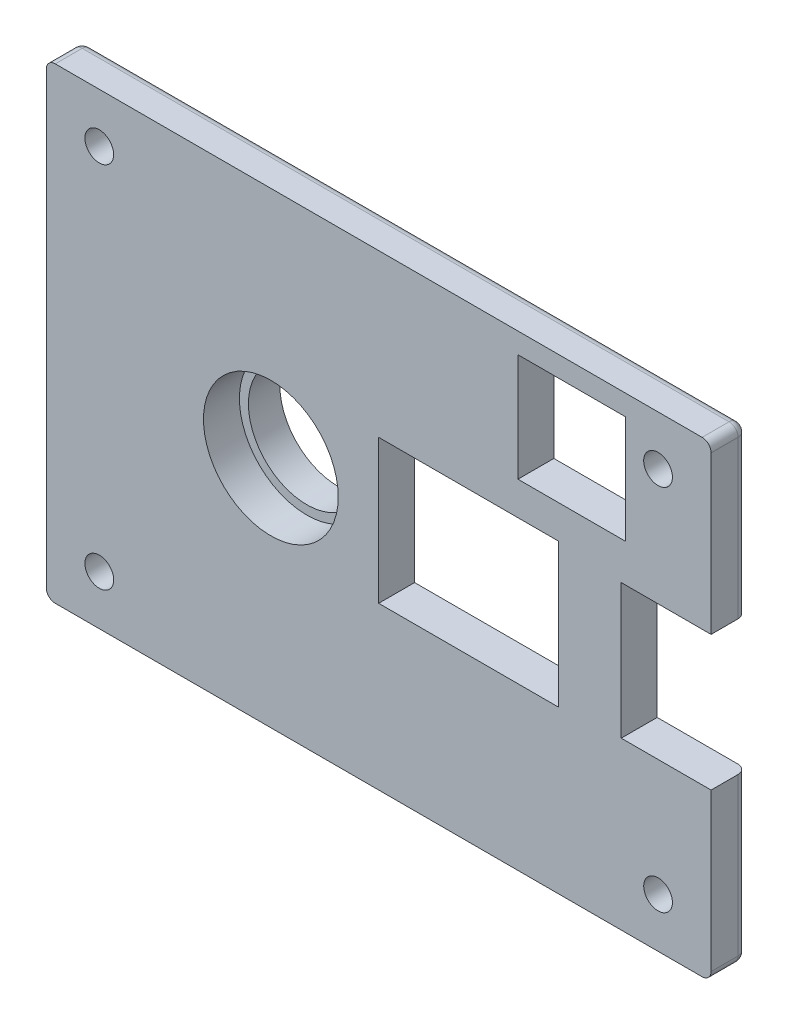
ISO-10303-21;
HEADER;
FILE_DESCRIPTION(('STEP AP214'),'2;1');
FILE_NAME('part.step','',(''),(''),'','','');
FILE_SCHEMA(('AUTOMOTIVE_DESIGN { 1 0 10303 214 1 1 1 1 }'));
ENDSEC;
DATA;
#1=APPLICATION_CONTEXT('core data for automotive mechanical design processes');
#2=APPLICATION_PROTOCOL_DEFINITION('international standard','automotive_design',2000,#1);
#3=PRODUCT_CONTEXT('',#1,'mechanical');
#4=PRODUCT('Part','Part','',(#3));
#5=PRODUCT_RELATED_PRODUCT_CATEGORY('part','',(#4));
#6=PRODUCT_DEFINITION_FORMATION('','',#4);
#7=PRODUCT_DEFINITION_CONTEXT('part definition',#1,'design');
#8=PRODUCT_DEFINITION('design','',#6,#7);
#9=PRODUCT_DEFINITION_SHAPE('','',#8);
#10=(LENGTH_UNIT() NAMED_UNIT(*) SI_UNIT(.MILLI.,.METRE.));
#11=(NAMED_UNIT(*) PLANE_ANGLE_UNIT() SI_UNIT($,.RADIAN.));
#12=(NAMED_UNIT(*) SI_UNIT($,.STERADIAN.) SOLID_ANGLE_UNIT());
#13=UNCERTAINTY_MEASURE_WITH_UNIT(LENGTH_MEASURE(1.E-05),#10,'distance_accuracy_value','');
#14=(GEOMETRIC_REPRESENTATION_CONTEXT(3) GLOBAL_UNCERTAINTY_ASSIGNED_CONTEXT((#13)) GLOBAL_UNIT_ASSIGNED_CONTEXT((#10,
#11,#12)) REPRESENTATION_CONTEXT('',''));
#15=CARTESIAN_POINT('',(0.,0.,0.));
#16=DIRECTION('',(0.,0.,1.));
#17=DIRECTION('',(1.,0.,0.));
#18=AXIS2_PLACEMENT_3D('',#15,#16,#17);
#19=CARTESIAN_POINT('',(37.,26.,4.));
#20=DIRECTION('',(-1.,0.,0.));
#21=DIRECTION('',(0.,-1.,0.));
#22=AXIS2_PLACEMENT_3D('',#19,#20,#21);
#23=PLANE('',#22);
#24=DIRECTION('',(0.,1.,0.));
#25=VECTOR('',#24,1.);
#26=CARTESIAN_POINT('',(37.,26.,4.));
#27=LINE('',#26,#25);
#28=CARTESIAN_POINT('',(37.,-25.,4.));
#29=VERTEX_POINT('',#28);
#30=CARTESIAN_POINT('',(37.,-7.5,4.));
#31=VERTEX_POINT('',#30);
#32=EDGE_CURVE('E371',#29,#31,#27,.T.);
#33=ORIENTED_EDGE('',*,*,#32,.F.);
#34=DIRECTION('',(0.,0.,-1.));
#35=VECTOR('',#34,1.);
#36=CARTESIAN_POINT('',(37.,-25.,4.));
#37=LINE('',#36,#35);
#38=CARTESIAN_POINT('',(37.,-25.,1.));
#39=VERTEX_POINT('',#38);
#40=EDGE_CURVE('E456',#29,#39,#37,.T.);
#41=ORIENTED_EDGE('',*,*,#40,.T.);
#42=DIRECTION('',(0.,1.,0.));
#43=VECTOR('',#42,1.);
#44=CARTESIAN_POINT('',(37.,26.,1.));
#45=LINE('',#44,#43);
#46=CARTESIAN_POINT('',(37.,-7.5,1.));
#47=VERTEX_POINT('',#46);
#48=EDGE_CURVE('E446',#39,#47,#45,.T.);
#49=ORIENTED_EDGE('',*,*,#48,.T.);
#50=DIRECTION('',(0.,0.,1.));
#51=VECTOR('',#50,1.);
#52=CARTESIAN_POINT('',(37.,-7.5,0.));
#53=LINE('',#52,#51);
#54=EDGE_CURVE('E243',#47,#31,#53,.T.);
#55=ORIENTED_EDGE('',*,*,#54,.T.);
#56=EDGE_LOOP('',(#33,#41,#49,#55));
#57=FACE_BOUND('',#56,.T.);
#58=ADVANCED_FACE('F40',(#57),#23,.F.);
#59=DIRECTION('',(0.,1.,0.));
#60=VECTOR('',#59,1.);
#61=CARTESIAN_POINT('',(37.,26.,1.));
#62=LINE('',#61,#60);
#63=CARTESIAN_POINT('',(37.,7.5,1.));
#64=VERTEX_POINT('',#63);
#65=CARTESIAN_POINT('',(37.,25.,1.));
#66=VERTEX_POINT('',#65);
#67=EDGE_CURVE('E486',#64,#66,#62,.T.);
#68=ORIENTED_EDGE('',*,*,#67,.T.);
#69=DIRECTION('',(0.,0.,-1.));
#70=VECTOR('',#69,1.);
#71=CARTESIAN_POINT('',(37.,25.,4.));
#72=LINE('',#71,#70);
#73=CARTESIAN_POINT('',(37.,25.,4.));
#74=VERTEX_POINT('',#73);
#75=EDGE_CURVE('E489',#66,#74,#72,.F.);
#76=ORIENTED_EDGE('',*,*,#75,.T.);
#77=CARTESIAN_POINT('',(37.,7.5,4.));
#78=VERTEX_POINT('',#77);
#79=EDGE_CURVE('E367',#78,#74,#27,.T.);
#80=ORIENTED_EDGE('',*,*,#79,.F.);
#81=DIRECTION('',(0.,0.,1.));
#82=VECTOR('',#81,1.);
#83=CARTESIAN_POINT('',(37.,7.5,0.));
#84=LINE('',#83,#82);
#85=EDGE_CURVE('E269',#64,#78,#84,.T.);
#86=ORIENTED_EDGE('',*,*,#85,.F.);
#87=EDGE_LOOP('',(#68,#76,#80,#86));
#88=FACE_BOUND('',#87,.T.);
#89=ADVANCED_FACE('F525',(#88),#23,.F.);
#90=CARTESIAN_POINT('',(-37.,26.,4.));
#91=DIRECTION('',(0.,-1.,0.));
#92=DIRECTION('',(0.,0.,-1.));
#93=AXIS2_PLACEMENT_3D('',#90,#91,#92);
#94=PLANE('',#93);
#95=DIRECTION('',(-1.,0.,0.));
#96=VECTOR('',#95,1.);
#97=CARTESIAN_POINT('',(-37.,26.,4.));
#98=LINE('',#97,#96);
#99=CARTESIAN_POINT('',(36.,26.,4.));
#100=VERTEX_POINT('',#99);
#101=CARTESIAN_POINT('',(-36.,26.,4.));
#102=VERTEX_POINT('',#101);
#103=EDGE_CURVE('E374',#100,#102,#98,.T.);
#104=ORIENTED_EDGE('',*,*,#103,.F.);
#105=DIRECTION('',(0.,0.,-1.));
#106=VECTOR('',#105,1.);
#107=CARTESIAN_POINT('',(36.,26.,4.));
#108=LINE('',#107,#106);
#109=CARTESIAN_POINT('',(36.,26.,1.));
#110=VERTEX_POINT('',#109);
#111=EDGE_CURVE('E475',#100,#110,#108,.T.);
#112=ORIENTED_EDGE('',*,*,#111,.T.);
#113=DIRECTION('',(-1.,0.,0.));
#114=VECTOR('',#113,1.);
#115=CARTESIAN_POINT('',(-37.,26.,1.));
#116=LINE('',#115,#114);
#117=CARTESIAN_POINT('',(-36.,26.,1.));
#118=VERTEX_POINT('',#117);
#119=EDGE_CURVE('E389',#110,#118,#116,.T.);
#120=ORIENTED_EDGE('',*,*,#119,.T.);
#121=DIRECTION('',(0.,0.,-1.));
#122=VECTOR('',#121,1.);
#123=CARTESIAN_POINT('',(-36.,26.,4.));
#124=LINE('',#123,#122);
#125=EDGE_CURVE('E403',#118,#102,#124,.F.);
#126=ORIENTED_EDGE('',*,*,#125,.T.);
#127=EDGE_LOOP('',(#104,#112,#120,#126));
#128=FACE_BOUND('',#127,.T.);
#129=ADVANCED_FACE('F533',(#128),#94,.F.);
#130=CARTESIAN_POINT('',(-37.,26.,4.));
#131=DIRECTION('',(1.,0.,0.));
#132=DIRECTION('',(0.,1.,0.));
#133=AXIS2_PLACEMENT_3D('',#130,#131,#132);
#134=PLANE('',#133);
#135=DIRECTION('',(0.,-1.,0.));
#136=VECTOR('',#135,1.);
#137=CARTESIAN_POINT('',(-37.,26.,1.));
#138=LINE('',#137,#136);
#139=CARTESIAN_POINT('',(-37.,25.,1.));
#140=VERTEX_POINT('',#139);
#141=CARTESIAN_POINT('',(-37.,-25.,1.));
#142=VERTEX_POINT('',#141);
#143=EDGE_CURVE('E395',#140,#142,#138,.T.);
#144=ORIENTED_EDGE('',*,*,#143,.T.);
#145=DIRECTION('',(0.,0.,-1.));
#146=VECTOR('',#145,1.);
#147=CARTESIAN_POINT('',(-37.,-25.,4.));
#148=LINE('',#147,#146);
#149=CARTESIAN_POINT('',(-37.,-25.,4.));
#150=VERTEX_POINT('',#149);
#151=EDGE_CURVE('E434',#142,#150,#148,.F.);
#152=ORIENTED_EDGE('',*,*,#151,.T.);
#153=DIRECTION('',(0.,-1.,0.));
#154=VECTOR('',#153,1.);
#155=CARTESIAN_POINT('',(-37.,26.,4.));
#156=LINE('',#155,#154);
#157=CARTESIAN_POINT('',(-37.,25.,4.));
#158=VERTEX_POINT('',#157);
#159=EDGE_CURVE('E377',#158,#150,#156,.T.);
#160=ORIENTED_EDGE('',*,*,#159,.F.);
#161=DIRECTION('',(0.,0.,-1.));
#162=VECTOR('',#161,1.);
#163=CARTESIAN_POINT('',(-37.,25.,4.));
#164=LINE('',#163,#162);
#165=EDGE_CURVE('E399',#158,#140,#164,.T.);
#166=ORIENTED_EDGE('',*,*,#165,.T.);
#167=EDGE_LOOP('',(#144,#152,#160,#166));
#168=FACE_BOUND('',#167,.T.);
#169=ADVANCED_FACE('F647',(#168),#134,.F.);
#170=CARTESIAN_POINT('',(-37.,-26.,4.));
#171=DIRECTION('',(0.,1.,0.));
#172=DIRECTION('',(0.,0.,1.));
#173=AXIS2_PLACEMENT_3D('',#170,#171,#172);
#174=PLANE('',#173);
#175=DIRECTION('',(1.,0.,0.));
#176=VECTOR('',#175,1.);
#177=CARTESIAN_POINT('',(-37.,-26.,1.));
#178=LINE('',#177,#176);
#179=CARTESIAN_POINT('',(-36.,-26.,1.));
#180=VERTEX_POINT('',#179);
#181=CARTESIAN_POINT('',(36.,-26.,1.));
#182=VERTEX_POINT('',#181);
#183=EDGE_CURVE('E417',#180,#182,#178,.T.);
#184=ORIENTED_EDGE('',*,*,#183,.T.);
#185=DIRECTION('',(0.,0.,-1.));
#186=VECTOR('',#185,1.);
#187=CARTESIAN_POINT('',(36.,-26.,4.));
#188=LINE('',#187,#186);
#189=CARTESIAN_POINT('',(36.,-26.,4.));
#190=VERTEX_POINT('',#189);
#191=EDGE_CURVE('E460',#182,#190,#188,.F.);
#192=ORIENTED_EDGE('',*,*,#191,.T.);
#193=DIRECTION('',(1.,0.,0.));
#194=VECTOR('',#193,1.);
#195=CARTESIAN_POINT('',(-37.,-26.,4.));
#196=LINE('',#195,#194);
#197=CARTESIAN_POINT('',(-36.,-26.,4.));
#198=VERTEX_POINT('',#197);
#199=EDGE_CURVE('E381',#198,#190,#196,.T.);
#200=ORIENTED_EDGE('',*,*,#199,.F.);
#201=DIRECTION('',(0.,0.,-1.));
#202=VECTOR('',#201,1.);
#203=CARTESIAN_POINT('',(-36.,-26.,4.));
#204=LINE('',#203,#202);
#205=EDGE_CURVE('E430',#198,#180,#204,.T.);
#206=ORIENTED_EDGE('',*,*,#205,.T.);
#207=EDGE_LOOP('',(#184,#192,#200,#206));
#208=FACE_BOUND('',#207,.T.);
#209=ADVANCED_FACE('F611',(#208),#174,.F.);
#210=CARTESIAN_POINT('',(0.,0.,4.));
#211=DIRECTION('',(0.,0.,1.));
#212=DIRECTION('',(1.,0.,0.));
#213=AXIS2_PLACEMENT_3D('',#210,#211,#212);
#214=PLANE('',#213);
#215=CARTESIAN_POINT('',(-12.,0.,4.));
#216=DIRECTION('',(0.,0.,1.));
#217=DIRECTION('',(1.,0.,0.));
#218=AXIS2_PLACEMENT_3D('',#215,#216,#217);
#219=CIRCLE('',#218,7.5);
#220=CARTESIAN_POINT('',(-4.49999999999999,0.,4.));
#221=VERTEX_POINT('',#220);
#222=EDGE_CURVE('E233',#221,#221,#219,.T.);
#223=ORIENTED_EDGE('',*,*,#222,.F.);
#224=EDGE_LOOP('',(#223));
#225=FACE_BOUND('',#224,.T.);
#226=DIRECTION('',(0.,1.,0.));
#227=VECTOR('',#226,1.);
#228=CARTESIAN_POINT('',(20.,8.,4.));
#229=LINE('',#228,#227);
#230=CARTESIAN_POINT('',(20.,-8.,4.));
#231=VERTEX_POINT('',#230);
#232=CARTESIAN_POINT('',(20.,8.,4.));
#233=VERTEX_POINT('',#232);
#234=EDGE_CURVE('E205',#231,#233,#229,.T.);
#235=ORIENTED_EDGE('',*,*,#234,.F.);
#236=DIRECTION('',(1.,0.,0.));
#237=VECTOR('',#236,1.);
#238=CARTESIAN_POINT('',(0.,-8.,4.));
#239=LINE('',#238,#237);
#240=CARTESIAN_POINT('',(0.,-8.,4.));
#241=VERTEX_POINT('',#240);
#242=EDGE_CURVE('E226',#241,#231,#239,.T.);
#243=ORIENTED_EDGE('',*,*,#242,.F.);
#244=DIRECTION('',(0.,-1.,0.));
#245=VECTOR('',#244,1.);
#246=CARTESIAN_POINT('',(0.,8.,4.));
#247=LINE('',#246,#245);
#248=CARTESIAN_POINT('',(0.,8.,4.));
#249=VERTEX_POINT('',#248);
#250=EDGE_CURVE('E230',#249,#241,#247,.T.);
#251=ORIENTED_EDGE('',*,*,#250,.F.);
#252=DIRECTION('',(-1.,0.,0.));
#253=VECTOR('',#252,1.);
#254=CARTESIAN_POINT('',(0.,8.,4.));
#255=LINE('',#254,#253);
#256=EDGE_CURVE('E242',#233,#249,#255,.T.);
#257=ORIENTED_EDGE('',*,*,#256,.F.);
#258=EDGE_LOOP('',(#235,#243,#251,#257));
#259=FACE_BOUND('',#258,.T.);
#260=ORIENTED_EDGE('',*,*,#79,.T.);
#261=CARTESIAN_POINT('',(36.,25.,4.));
#262=DIRECTION('',(0.,0.,1.));
#263=DIRECTION('',(1.,0.,0.));
#264=AXIS2_PLACEMENT_3D('',#261,#262,#263);
#265=CIRCLE('',#264,1.);
#266=EDGE_CURVE('E492',#74,#100,#265,.T.);
#267=ORIENTED_EDGE('',*,*,#266,.T.);
#268=ORIENTED_EDGE('',*,*,#103,.T.);
#269=CARTESIAN_POINT('',(-36.,25.,4.));
#270=DIRECTION('',(0.,0.,1.));
#271=DIRECTION('',(1.,0.,0.));
#272=AXIS2_PLACEMENT_3D('',#269,#270,#271);
#273=CIRCLE('',#272,1.);
#274=EDGE_CURVE('E407',#102,#158,#273,.T.);
#275=ORIENTED_EDGE('',*,*,#274,.T.);
#276=ORIENTED_EDGE('',*,*,#159,.T.);
#277=CARTESIAN_POINT('',(-36.,-25.,4.));
#278=DIRECTION('',(0.,0.,1.));
#279=DIRECTION('',(1.,0.,0.));
#280=AXIS2_PLACEMENT_3D('',#277,#278,#279);
#281=CIRCLE('',#280,1.);
#282=EDGE_CURVE('E437',#150,#198,#281,.T.);
#283=ORIENTED_EDGE('',*,*,#282,.T.);
#284=ORIENTED_EDGE('',*,*,#199,.T.);
#285=CARTESIAN_POINT('',(36.,-25.,4.));
#286=DIRECTION('',(0.,0.,1.));
#287=DIRECTION('',(1.,0.,0.));
#288=AXIS2_PLACEMENT_3D('',#285,#286,#287);
#289=CIRCLE('',#288,1.);
#290=EDGE_CURVE('E463',#190,#29,#289,.T.);
#291=ORIENTED_EDGE('',*,*,#290,.T.);
#292=ORIENTED_EDGE('',*,*,#32,.T.);
#293=DIRECTION('',(1.,0.,0.));
#294=VECTOR('',#293,1.);
#295=CARTESIAN_POINT('',(27.,-7.5,4.));
#296=LINE('',#295,#294);
#297=CARTESIAN_POINT('',(27.,-7.5,4.));
#298=VERTEX_POINT('',#297);
#299=EDGE_CURVE('E261',#298,#31,#296,.T.);
#300=ORIENTED_EDGE('',*,*,#299,.F.);
#301=DIRECTION('',(0.,-1.,0.));
#302=VECTOR('',#301,1.);
#303=CARTESIAN_POINT('',(27.,7.5,4.));
#304=LINE('',#303,#302);
#305=CARTESIAN_POINT('',(27.,7.5,4.));
#306=VERTEX_POINT('',#305);
#307=EDGE_CURVE('E274',#306,#298,#304,.T.);
#308=ORIENTED_EDGE('',*,*,#307,.F.);
#309=DIRECTION('',(-1.,0.,0.));
#310=VECTOR('',#309,1.);
#311=CARTESIAN_POINT('',(27.,7.5,4.));
#312=LINE('',#311,#310);
#313=EDGE_CURVE('E270',#78,#306,#312,.T.);
#314=ORIENTED_EDGE('',*,*,#313,.F.);
#315=EDGE_LOOP('',(#260,#267,#268,#275,#276,#283,#284,#291,#292,#300,#308,#314));
#316=FACE_BOUND('',#315,.T.);
#317=DIRECTION('',(0.,1.,0.));
#318=VECTOR('',#317,1.);
#319=CARTESIAN_POINT('',(27.5,23.714,4.));
#320=LINE('',#319,#318);
#321=CARTESIAN_POINT('',(27.5,11.714,4.));
#322=VERTEX_POINT('',#321);
#323=CARTESIAN_POINT('',(27.5,23.714,4.));
#324=VERTEX_POINT('',#323);
#325=EDGE_CURVE('E311',#322,#324,#320,.T.);
#326=ORIENTED_EDGE('',*,*,#325,.F.);
#327=DIRECTION('',(1.,0.,0.));
#328=VECTOR('',#327,1.);
#329=CARTESIAN_POINT('',(15.5,11.714,4.));
#330=LINE('',#329,#328);
#331=CARTESIAN_POINT('',(15.5,11.714,4.));
#332=VERTEX_POINT('',#331);
#333=EDGE_CURVE('E298',#332,#322,#330,.T.);
#334=ORIENTED_EDGE('',*,*,#333,.F.);
#335=DIRECTION('',(0.,-1.,0.));
#336=VECTOR('',#335,1.);
#337=CARTESIAN_POINT('',(15.5,23.714,4.));
#338=LINE('',#337,#336);
#339=CARTESIAN_POINT('',(15.5,23.714,4.));
#340=VERTEX_POINT('',#339);
#341=EDGE_CURVE('E319',#340,#332,#338,.T.);
#342=ORIENTED_EDGE('',*,*,#341,.F.);
#343=DIRECTION('',(-1.,0.,0.));
#344=VECTOR('',#343,1.);
#345=CARTESIAN_POINT('',(15.5,23.714,4.));
#346=LINE('',#345,#344);
#347=EDGE_CURVE('E314',#324,#340,#346,.T.);
#348=ORIENTED_EDGE('',*,*,#347,.F.);
#349=EDGE_LOOP('',(#326,#334,#342,#348));
#350=FACE_BOUND('',#349,.T.);
#351=CARTESIAN_POINT('',(-31.096,-20.5,4.));
#352=DIRECTION('',(0.,0.,1.));
#353=DIRECTION('',(1.,0.,0.));
#354=AXIS2_PLACEMENT_3D('',#351,#352,#353);
#355=CIRCLE('',#354,1.6);
#356=CARTESIAN_POINT('',(-29.496,-20.5,4.));
#357=VERTEX_POINT('',#356);
#358=EDGE_CURVE('E358',#357,#357,#355,.T.);
#359=ORIENTED_EDGE('',*,*,#358,.F.);
#360=EDGE_LOOP('',(#359));
#361=FACE_BOUND('',#360,.T.);
#362=CARTESIAN_POINT('',(31.1,-20.5,4.));
#363=DIRECTION('',(0.,0.,1.));
#364=DIRECTION('',(1.,0.,0.));
#365=AXIS2_PLACEMENT_3D('',#362,#363,#364);
#366=CIRCLE('',#365,1.6);
#367=CARTESIAN_POINT('',(32.7,-20.5,4.));
#368=VERTEX_POINT('',#367);
#369=EDGE_CURVE('E350',#368,#368,#366,.T.);
#370=ORIENTED_EDGE('',*,*,#369,.F.);
#371=EDGE_LOOP('',(#370));
#372=FACE_BOUND('',#371,.T.);
#373=CARTESIAN_POINT('',(31.096,20.5,4.));
#374=DIRECTION('',(0.,0.,1.));
#375=DIRECTION('',(1.,0.,0.));
#376=AXIS2_PLACEMENT_3D('',#373,#374,#375);
#377=CIRCLE('',#376,1.6);
#378=CARTESIAN_POINT('',(32.696,20.5,4.));
#379=VERTEX_POINT('',#378);
#380=EDGE_CURVE('E342',#379,#379,#377,.T.);
#381=ORIENTED_EDGE('',*,*,#380,.F.);
#382=EDGE_LOOP('',(#381));
#383=FACE_BOUND('',#382,.T.);
#384=CARTESIAN_POINT('',(-31.1,20.5,4.));
#385=DIRECTION('',(0.,0.,1.));
#386=DIRECTION('',(1.,0.,0.));
#387=AXIS2_PLACEMENT_3D('',#384,#385,#386);
#388=CIRCLE('',#387,1.6);
#389=CARTESIAN_POINT('',(-29.5,20.5,4.));
#390=VERTEX_POINT('',#389);
#391=EDGE_CURVE('E341',#390,#390,#388,.T.);
#392=ORIENTED_EDGE('',*,*,#391,.F.);
#393=EDGE_LOOP('',(#392));
#394=FACE_BOUND('',#393,.T.);
#395=ADVANCED_FACE('F608',(#225,#259,#316,#350,#361,#372,#383,#394),#214,.T.);
#396=CARTESIAN_POINT('',(0.,0.,0.));
#397=DIRECTION('',(0.,0.,1.));
#398=DIRECTION('',(1.,0.,0.));
#399=AXIS2_PLACEMENT_3D('',#396,#397,#398);
#400=PLANE('',#399);
#401=CARTESIAN_POINT('',(-12.,0.,0.));
#402=DIRECTION('',(0.,0.,1.));
#403=DIRECTION('',(1.,0.,0.));
#404=AXIS2_PLACEMENT_3D('',#401,#402,#403);
#405=CIRCLE('',#404,9.);
#406=CARTESIAN_POINT('',(-3.,0.,0.));
#407=VERTEX_POINT('',#406);
#408=EDGE_CURVE('E385',#407,#407,#405,.F.);
#409=ORIENTED_EDGE('',*,*,#408,.F.);
#410=EDGE_LOOP('',(#409));
#411=FACE_BOUND('',#410,.T.);
#412=DIRECTION('',(1.,0.,0.));
#413=VECTOR('',#412,1.);
#414=CARTESIAN_POINT('',(0.,-8.,0.));
#415=LINE('',#414,#413);
#416=CARTESIAN_POINT('',(0.,-8.,0.));
#417=VERTEX_POINT('',#416);
#418=CARTESIAN_POINT('',(20.,-8.,0.));
#419=VERTEX_POINT('',#418);
#420=EDGE_CURVE('E211',#417,#419,#415,.T.);
#421=ORIENTED_EDGE('',*,*,#420,.T.);
#422=DIRECTION('',(0.,1.,0.));
#423=VECTOR('',#422,1.);
#424=CARTESIAN_POINT('',(20.,8.,0.));
#425=LINE('',#424,#423);
#426=CARTESIAN_POINT('',(20.,8.,0.));
#427=VERTEX_POINT('',#426);
#428=EDGE_CURVE('E202',#419,#427,#425,.T.);
#429=ORIENTED_EDGE('',*,*,#428,.T.);
#430=DIRECTION('',(-1.,0.,0.));
#431=VECTOR('',#430,1.);
#432=CARTESIAN_POINT('',(0.,8.,0.));
#433=LINE('',#432,#431);
#434=CARTESIAN_POINT('',(0.,8.,0.));
#435=VERTEX_POINT('',#434);
#436=EDGE_CURVE('E215',#427,#435,#433,.T.);
#437=ORIENTED_EDGE('',*,*,#436,.T.);
#438=DIRECTION('',(0.,-1.,0.));
#439=VECTOR('',#438,1.);
#440=CARTESIAN_POINT('',(0.,8.,0.));
#441=LINE('',#440,#439);
#442=EDGE_CURVE('E220',#435,#417,#441,.T.);
#443=ORIENTED_EDGE('',*,*,#442,.T.);
#444=EDGE_LOOP('',(#421,#429,#437,#443));
#445=FACE_BOUND('',#444,.T.);
#446=DIRECTION('',(1.,0.,0.));
#447=VECTOR('',#446,1.);
#448=CARTESIAN_POINT('',(15.5,11.714,0.));
#449=LINE('',#448,#447);
#450=CARTESIAN_POINT('',(15.5,11.714,0.));
#451=VERTEX_POINT('',#450);
#452=CARTESIAN_POINT('',(27.5,11.714,0.));
#453=VERTEX_POINT('',#452);
#454=EDGE_CURVE('E306',#451,#453,#449,.T.);
#455=ORIENTED_EDGE('',*,*,#454,.T.);
#456=DIRECTION('',(0.,1.,0.));
#457=VECTOR('',#456,1.);
#458=CARTESIAN_POINT('',(27.5,23.714,0.));
#459=LINE('',#458,#457);
#460=CARTESIAN_POINT('',(27.5,23.714,0.));
#461=VERTEX_POINT('',#460);
#462=EDGE_CURVE('E293',#453,#461,#459,.T.);
#463=ORIENTED_EDGE('',*,*,#462,.T.);
#464=DIRECTION('',(-1.,0.,0.));
#465=VECTOR('',#464,1.);
#466=CARTESIAN_POINT('',(15.5,23.714,0.));
#467=LINE('',#466,#465);
#468=CARTESIAN_POINT('',(15.5,23.714,0.));
#469=VERTEX_POINT('',#468);
#470=EDGE_CURVE('E297',#461,#469,#467,.T.);
#471=ORIENTED_EDGE('',*,*,#470,.T.);
#472=DIRECTION('',(0.,-1.,0.));
#473=VECTOR('',#472,1.);
#474=CARTESIAN_POINT('',(15.5,23.714,0.));
#475=LINE('',#474,#473);
#476=EDGE_CURVE('E302',#469,#451,#475,.T.);
#477=ORIENTED_EDGE('',*,*,#476,.T.);
#478=EDGE_LOOP('',(#455,#463,#471,#477));
#479=FACE_BOUND('',#478,.T.);
#480=CARTESIAN_POINT('',(-31.096,-20.5,0.));
#481=DIRECTION('',(0.,0.,1.));
#482=DIRECTION('',(1.,0.,0.));
#483=AXIS2_PLACEMENT_3D('',#480,#481,#482);
#484=CIRCLE('',#483,1.6);
#485=CARTESIAN_POINT('',(-29.496,-20.5,0.));
#486=VERTEX_POINT('',#485);
#487=EDGE_CURVE('E354',#486,#486,#484,.T.);
#488=ORIENTED_EDGE('',*,*,#487,.T.);
#489=EDGE_LOOP('',(#488));
#490=FACE_BOUND('',#489,.T.);
#491=CARTESIAN_POINT('',(31.1,-20.5,0.));
#492=DIRECTION('',(0.,0.,1.));
#493=DIRECTION('',(1.,0.,0.));
#494=AXIS2_PLACEMENT_3D('',#491,#492,#493);
#495=CIRCLE('',#494,1.6);
#496=CARTESIAN_POINT('',(32.7,-20.5,0.));
#497=VERTEX_POINT('',#496);
#498=EDGE_CURVE('E346',#497,#497,#495,.T.);
#499=ORIENTED_EDGE('',*,*,#498,.T.);
#500=EDGE_LOOP('',(#499));
#501=FACE_BOUND('',#500,.T.);
#502=CARTESIAN_POINT('',(31.096,20.5,0.));
#503=DIRECTION('',(0.,0.,1.));
#504=DIRECTION('',(1.,0.,0.));
#505=AXIS2_PLACEMENT_3D('',#502,#503,#504);
#506=CIRCLE('',#505,1.6);
#507=CARTESIAN_POINT('',(32.696,20.5,0.));
#508=VERTEX_POINT('',#507);
#509=EDGE_CURVE('E337',#508,#508,#506,.T.);
#510=ORIENTED_EDGE('',*,*,#509,.T.);
#511=EDGE_LOOP('',(#510));
#512=FACE_BOUND('',#511,.T.);
#513=CARTESIAN_POINT('',(-31.1,20.5,0.));
#514=DIRECTION('',(0.,0.,1.));
#515=DIRECTION('',(1.,0.,0.));
#516=AXIS2_PLACEMENT_3D('',#513,#514,#515);
#517=CIRCLE('',#516,1.6);
#518=CARTESIAN_POINT('',(-29.5,20.5,0.));
#519=VERTEX_POINT('',#518);
#520=EDGE_CURVE('E363',#519,#519,#517,.T.);
#521=ORIENTED_EDGE('',*,*,#520,.T.);
#522=EDGE_LOOP('',(#521));
#523=FACE_BOUND('',#522,.T.);
#524=DIRECTION('',(-1.,0.,0.));
#525=VECTOR('',#524,1.);
#526=CARTESIAN_POINT('',(0.,25.,0.));
#527=LINE('',#526,#525);
#528=CARTESIAN_POINT('',(-36.,25.,0.));
#529=VERTEX_POINT('',#528);
#530=CARTESIAN_POINT('',(36.,25.,0.));
#531=VERTEX_POINT('',#530);
#532=EDGE_CURVE('E392',#529,#531,#527,.F.);
#533=ORIENTED_EDGE('',*,*,#532,.T.);
#534=DIRECTION('',(0.,1.,0.));
#535=VECTOR('',#534,1.);
#536=CARTESIAN_POINT('',(36.,0.,0.));
#537=LINE('',#536,#535);
#538=CARTESIAN_POINT('',(36.,7.5,0.));
#539=VERTEX_POINT('',#538);
#540=EDGE_CURVE('E56',#531,#539,#537,.F.);
#541=ORIENTED_EDGE('',*,*,#540,.T.);
#542=DIRECTION('',(-1.,0.,0.));
#543=VECTOR('',#542,1.);
#544=CARTESIAN_POINT('',(27.,7.5,0.));
#545=LINE('',#544,#543);
#546=CARTESIAN_POINT('',(27.,7.5,0.));
#547=VERTEX_POINT('',#546);
#548=EDGE_CURVE('E257',#539,#547,#545,.T.);
#549=ORIENTED_EDGE('',*,*,#548,.T.);
#550=DIRECTION('',(0.,-1.,0.));
#551=VECTOR('',#550,1.);
#552=CARTESIAN_POINT('',(27.,7.5,0.));
#553=LINE('',#552,#551);
#554=CARTESIAN_POINT('',(27.,-7.5,0.));
#555=VERTEX_POINT('',#554);
#556=EDGE_CURVE('E260',#547,#555,#553,.T.);
#557=ORIENTED_EDGE('',*,*,#556,.T.);
#558=DIRECTION('',(1.,0.,0.));
#559=VECTOR('',#558,1.);
#560=CARTESIAN_POINT('',(27.,-7.5,0.));
#561=LINE('',#560,#559);
#562=CARTESIAN_POINT('',(36.,-7.5,0.));
#563=VERTEX_POINT('',#562);
#564=EDGE_CURVE('E265',#555,#563,#561,.T.);
#565=ORIENTED_EDGE('',*,*,#564,.T.);
#566=DIRECTION('',(0.,1.,0.));
#567=VECTOR('',#566,1.);
#568=CARTESIAN_POINT('',(36.,0.,0.));
#569=LINE('',#568,#567);
#570=CARTESIAN_POINT('',(36.,-25.,0.));
#571=VERTEX_POINT('',#570);
#572=EDGE_CURVE('E472',#563,#571,#569,.F.);
#573=ORIENTED_EDGE('',*,*,#572,.T.);
#574=DIRECTION('',(1.,0.,0.));
#575=VECTOR('',#574,1.);
#576=CARTESIAN_POINT('',(0.,-25.,0.));
#577=LINE('',#576,#575);
#578=CARTESIAN_POINT('',(-36.,-25.,0.));
#579=VERTEX_POINT('',#578);
#580=EDGE_CURVE('E443',#571,#579,#577,.F.);
#581=ORIENTED_EDGE('',*,*,#580,.T.);
#582=DIRECTION('',(0.,-1.,0.));
#583=VECTOR('',#582,1.);
#584=CARTESIAN_POINT('',(-36.,0.,0.));
#585=LINE('',#584,#583);
#586=EDGE_CURVE('E414',#579,#529,#585,.F.);
#587=ORIENTED_EDGE('',*,*,#586,.T.);
#588=EDGE_LOOP('',(#533,#541,#549,#557,#565,#573,#581,#587));
#589=FACE_BOUND('',#588,.T.);
#590=ADVANCED_FACE('F222',(#411,#445,#479,#490,#501,#512,#523,#589),#400,.F.);
#591=CARTESIAN_POINT('',(-31.1,20.5,0.));
#592=DIRECTION('',(0.,0.,1.));
#593=DIRECTION('',(1.,0.,0.));
#594=AXIS2_PLACEMENT_3D('',#591,#592,#593);
#595=CYLINDRICAL_SURFACE('',#594,1.6);
#596=ORIENTED_EDGE('',*,*,#520,.F.);
#597=EDGE_LOOP('',(#596));
#598=FACE_BOUND('',#597,.T.);
#599=ORIENTED_EDGE('',*,*,#391,.T.);
#600=EDGE_LOOP('',(#599));
#601=FACE_BOUND('',#600,.T.);
#602=ADVANCED_FACE('F627',(#598,#601),#595,.F.);
#603=CARTESIAN_POINT('',(31.096,20.5,0.));
#604=DIRECTION('',(0.,0.,1.));
#605=DIRECTION('',(1.,0.,0.));
#606=AXIS2_PLACEMENT_3D('',#603,#604,#605);
#607=CYLINDRICAL_SURFACE('',#606,1.6);
#608=ORIENTED_EDGE('',*,*,#509,.F.);
#609=EDGE_LOOP('',(#608));
#610=FACE_BOUND('',#609,.T.);
#611=ORIENTED_EDGE('',*,*,#380,.T.);
#612=EDGE_LOOP('',(#611));
#613=FACE_BOUND('',#612,.T.);
#614=ADVANCED_FACE('F629',(#610,#613),#607,.F.);
#615=CARTESIAN_POINT('',(31.1,-20.5,0.));
#616=DIRECTION('',(0.,0.,1.));
#617=DIRECTION('',(1.,0.,0.));
#618=AXIS2_PLACEMENT_3D('',#615,#616,#617);
#619=CYLINDRICAL_SURFACE('',#618,1.6);
#620=ORIENTED_EDGE('',*,*,#498,.F.);
#621=EDGE_LOOP('',(#620));
#622=FACE_BOUND('',#621,.T.);
#623=ORIENTED_EDGE('',*,*,#369,.T.);
#624=EDGE_LOOP('',(#623));
#625=FACE_BOUND('',#624,.T.);
#626=ADVANCED_FACE('F636',(#622,#625),#619,.F.);
#627=CARTESIAN_POINT('',(-31.096,-20.5,0.));
#628=DIRECTION('',(0.,0.,1.));
#629=DIRECTION('',(1.,0.,0.));
#630=AXIS2_PLACEMENT_3D('',#627,#628,#629);
#631=CYLINDRICAL_SURFACE('',#630,1.6);
#632=ORIENTED_EDGE('',*,*,#487,.F.);
#633=EDGE_LOOP('',(#632));
#634=FACE_BOUND('',#633,.T.);
#635=ORIENTED_EDGE('',*,*,#358,.T.);
#636=EDGE_LOOP('',(#635));
#637=FACE_BOUND('',#636,.T.);
#638=ADVANCED_FACE('F644',(#634,#637),#631,.F.);
#639=CARTESIAN_POINT('',(27.5,23.714,0.));
#640=DIRECTION('',(1.,0.,0.));
#641=DIRECTION('',(0.,1.,0.));
#642=AXIS2_PLACEMENT_3D('',#639,#640,#641);
#643=PLANE('',#642);
#644=ORIENTED_EDGE('',*,*,#325,.T.);
#645=DIRECTION('',(0.,0.,1.));
#646=VECTOR('',#645,1.);
#647=CARTESIAN_POINT('',(27.5,23.714,0.));
#648=LINE('',#647,#646);
#649=EDGE_CURVE('E310',#461,#324,#648,.T.);
#650=ORIENTED_EDGE('',*,*,#649,.F.);
#651=ORIENTED_EDGE('',*,*,#462,.F.);
#652=DIRECTION('',(0.,0.,1.));
#653=VECTOR('',#652,1.);
#654=CARTESIAN_POINT('',(27.5,11.714,0.));
#655=LINE('',#654,#653);
#656=EDGE_CURVE('E275',#453,#322,#655,.T.);
#657=ORIENTED_EDGE('',*,*,#656,.T.);
#658=EDGE_LOOP('',(#644,#650,#651,#657));
#659=FACE_BOUND('',#658,.T.);
#660=ADVANCED_FACE('F713',(#659),#643,.F.);
#661=CARTESIAN_POINT('',(15.5,11.714,0.));
#662=DIRECTION('',(0.,-1.,0.));
#663=DIRECTION('',(1.,0.,0.));
#664=AXIS2_PLACEMENT_3D('',#661,#662,#663);
#665=PLANE('',#664);
#666=ORIENTED_EDGE('',*,*,#333,.T.);
#667=ORIENTED_EDGE('',*,*,#656,.F.);
#668=ORIENTED_EDGE('',*,*,#454,.F.);
#669=DIRECTION('',(0.,0.,1.));
#670=VECTOR('',#669,1.);
#671=CARTESIAN_POINT('',(15.5,11.714,0.));
#672=LINE('',#671,#670);
#673=EDGE_CURVE('E328',#451,#332,#672,.T.);
#674=ORIENTED_EDGE('',*,*,#673,.T.);
#675=EDGE_LOOP('',(#666,#667,#668,#674));
#676=FACE_BOUND('',#675,.T.);
#677=ADVANCED_FACE('F709',(#676),#665,.F.);
#678=CARTESIAN_POINT('',(15.5,23.714,0.));
#679=DIRECTION('',(-1.,0.,0.));
#680=DIRECTION('',(0.,-1.,0.));
#681=AXIS2_PLACEMENT_3D('',#678,#679,#680);
#682=PLANE('',#681);
#683=ORIENTED_EDGE('',*,*,#341,.T.);
#684=ORIENTED_EDGE('',*,*,#673,.F.);
#685=ORIENTED_EDGE('',*,*,#476,.F.);
#686=DIRECTION('',(0.,0.,1.));
#687=VECTOR('',#686,1.);
#688=CARTESIAN_POINT('',(15.5,23.714,0.));
#689=LINE('',#688,#687);
#690=EDGE_CURVE('E331',#469,#340,#689,.T.);
#691=ORIENTED_EDGE('',*,*,#690,.T.);
#692=EDGE_LOOP('',(#683,#684,#685,#691));
#693=FACE_BOUND('',#692,.T.);
#694=ADVANCED_FACE('F712',(#693),#682,.F.);
#695=CARTESIAN_POINT('',(15.5,23.714,0.));
#696=DIRECTION('',(0.,1.,0.));
#697=DIRECTION('',(0.,0.,1.));
#698=AXIS2_PLACEMENT_3D('',#695,#696,#697);
#699=PLANE('',#698);
#700=ORIENTED_EDGE('',*,*,#347,.T.);
#701=ORIENTED_EDGE('',*,*,#690,.F.);
#702=ORIENTED_EDGE('',*,*,#470,.F.);
#703=ORIENTED_EDGE('',*,*,#649,.T.);
#704=EDGE_LOOP('',(#700,#701,#702,#703));
#705=FACE_BOUND('',#704,.T.);
#706=ADVANCED_FACE('F705',(#705),#699,.F.);
#707=CARTESIAN_POINT('',(27.,-7.5,0.));
#708=DIRECTION('',(0.,-1.,0.));
#709=DIRECTION('',(0.,0.,-1.));
#710=AXIS2_PLACEMENT_3D('',#707,#708,#709);
#711=PLANE('',#710);
#712=ORIENTED_EDGE('',*,*,#54,.F.);
#713=CARTESIAN_POINT('',(36.,-7.5,1.));
#714=DIRECTION('',(0.,-1.,0.));
#715=DIRECTION('',(0.,0.,-1.));
#716=AXIS2_PLACEMENT_3D('',#713,#714,#715);
#717=CIRCLE('',#716,1.);
#718=EDGE_CURVE('E469',#47,#563,#717,.F.);
#719=ORIENTED_EDGE('',*,*,#718,.T.);
#720=ORIENTED_EDGE('',*,*,#564,.F.);
#721=DIRECTION('',(0.,0.,1.));
#722=VECTOR('',#721,1.);
#723=CARTESIAN_POINT('',(27.,-7.5,0.));
#724=LINE('',#723,#722);
#725=EDGE_CURVE('E285',#555,#298,#724,.T.);
#726=ORIENTED_EDGE('',*,*,#725,.T.);
#727=ORIENTED_EDGE('',*,*,#299,.T.);
#728=EDGE_LOOP('',(#712,#719,#720,#726,#727));
#729=FACE_BOUND('',#728,.T.);
#730=ADVANCED_FACE('F680',(#729),#711,.F.);
#731=CARTESIAN_POINT('',(27.,7.5,0.));
#732=DIRECTION('',(-1.,0.,0.));
#733=DIRECTION('',(0.,-1.,0.));
#734=AXIS2_PLACEMENT_3D('',#731,#732,#733);
#735=PLANE('',#734);
#736=ORIENTED_EDGE('',*,*,#307,.T.);
#737=ORIENTED_EDGE('',*,*,#725,.F.);
#738=ORIENTED_EDGE('',*,*,#556,.F.);
#739=DIRECTION('',(0.,0.,1.));
#740=VECTOR('',#739,1.);
#741=CARTESIAN_POINT('',(27.,7.5,0.));
#742=LINE('',#741,#740);
#743=EDGE_CURVE('E288',#547,#306,#742,.T.);
#744=ORIENTED_EDGE('',*,*,#743,.T.);
#745=EDGE_LOOP('',(#736,#737,#738,#744));
#746=FACE_BOUND('',#745,.T.);
#747=ADVANCED_FACE('F685',(#746),#735,.F.);
#748=CARTESIAN_POINT('',(27.,7.5,0.));
#749=DIRECTION('',(0.,1.,0.));
#750=DIRECTION('',(0.,0.,1.));
#751=AXIS2_PLACEMENT_3D('',#748,#749,#750);
#752=PLANE('',#751);
#753=ORIENTED_EDGE('',*,*,#548,.F.);
#754=CARTESIAN_POINT('',(36.,7.5,1.));
#755=DIRECTION('',(0.,1.,0.));
#756=DIRECTION('',(0.,0.,1.));
#757=AXIS2_PLACEMENT_3D('',#754,#755,#756);
#758=CIRCLE('',#757,1.);
#759=EDGE_CURVE('E499',#539,#64,#758,.F.);
#760=ORIENTED_EDGE('',*,*,#759,.T.);
#761=ORIENTED_EDGE('',*,*,#85,.T.);
#762=ORIENTED_EDGE('',*,*,#313,.T.);
#763=ORIENTED_EDGE('',*,*,#743,.F.);
#764=EDGE_LOOP('',(#753,#760,#761,#762,#763));
#765=FACE_BOUND('',#764,.T.);
#766=ADVANCED_FACE('F591',(#765),#752,.F.);
#767=CARTESIAN_POINT('',(20.,8.,0.));
#768=DIRECTION('',(1.,0.,0.));
#769=DIRECTION('',(0.,1.,0.));
#770=AXIS2_PLACEMENT_3D('',#767,#768,#769);
#771=PLANE('',#770);
#772=ORIENTED_EDGE('',*,*,#234,.T.);
#773=DIRECTION('',(0.,0.,1.));
#774=VECTOR('',#773,1.);
#775=CARTESIAN_POINT('',(20.,8.,0.));
#776=LINE('',#775,#774);
#777=EDGE_CURVE('E198',#427,#233,#776,.T.);
#778=ORIENTED_EDGE('',*,*,#777,.F.);
#779=ORIENTED_EDGE('',*,*,#428,.F.);
#780=DIRECTION('',(0.,0.,1.));
#781=VECTOR('',#780,1.);
#782=CARTESIAN_POINT('',(20.,-8.,0.));
#783=LINE('',#782,#781);
#784=EDGE_CURVE('E249',#419,#231,#783,.T.);
#785=ORIENTED_EDGE('',*,*,#784,.T.);
#786=EDGE_LOOP('',(#772,#778,#779,#785));
#787=FACE_BOUND('',#786,.T.);
#788=ADVANCED_FACE('F200',(#787),#771,.F.);
#789=CARTESIAN_POINT('',(0.,-8.,0.));
#790=DIRECTION('',(0.,-1.,0.));
#791=DIRECTION('',(0.,0.,-1.));
#792=AXIS2_PLACEMENT_3D('',#789,#790,#791);
#793=PLANE('',#792);
#794=ORIENTED_EDGE('',*,*,#242,.T.);
#795=ORIENTED_EDGE('',*,*,#784,.F.);
#796=ORIENTED_EDGE('',*,*,#420,.F.);
#797=DIRECTION('',(0.,0.,1.));
#798=VECTOR('',#797,1.);
#799=CARTESIAN_POINT('',(0.,-8.,0.));
#800=LINE('',#799,#798);
#801=EDGE_CURVE('E252',#417,#241,#800,.T.);
#802=ORIENTED_EDGE('',*,*,#801,.T.);
#803=EDGE_LOOP('',(#794,#795,#796,#802));
#804=FACE_BOUND('',#803,.T.);
#805=ADVANCED_FACE('F929',(#804),#793,.F.);
#806=CARTESIAN_POINT('',(0.,8.,0.));
#807=DIRECTION('',(-1.,0.,0.));
#808=DIRECTION('',(0.,-1.,0.));
#809=AXIS2_PLACEMENT_3D('',#806,#807,#808);
#810=PLANE('',#809);
#811=ORIENTED_EDGE('',*,*,#250,.T.);
#812=ORIENTED_EDGE('',*,*,#801,.F.);
#813=ORIENTED_EDGE('',*,*,#442,.F.);
#814=DIRECTION('',(0.,0.,1.));
#815=VECTOR('',#814,1.);
#816=CARTESIAN_POINT('',(0.,8.,0.));
#817=LINE('',#816,#815);
#818=EDGE_CURVE('E210',#435,#249,#817,.T.);
#819=ORIENTED_EDGE('',*,*,#818,.T.);
#820=EDGE_LOOP('',(#811,#812,#813,#819));
#821=FACE_BOUND('',#820,.T.);
#822=ADVANCED_FACE('F920',(#821),#810,.F.);
#823=CARTESIAN_POINT('',(0.,8.,0.));
#824=DIRECTION('',(0.,1.,0.));
#825=DIRECTION('',(0.,0.,1.));
#826=AXIS2_PLACEMENT_3D('',#823,#824,#825);
#827=PLANE('',#826);
#828=ORIENTED_EDGE('',*,*,#256,.T.);
#829=ORIENTED_EDGE('',*,*,#818,.F.);
#830=ORIENTED_EDGE('',*,*,#436,.F.);
#831=ORIENTED_EDGE('',*,*,#777,.T.);
#832=EDGE_LOOP('',(#828,#829,#830,#831));
#833=FACE_BOUND('',#832,.T.);
#834=ADVANCED_FACE('F216',(#833),#827,.F.);
#835=CARTESIAN_POINT('',(-12.,0.,0.));
#836=DIRECTION('',(0.,0.,1.));
#837=DIRECTION('',(1.,0.,0.));
#838=AXIS2_PLACEMENT_3D('',#835,#836,#837);
#839=CYLINDRICAL_SURFACE('',#838,7.5);
#840=CARTESIAN_POINT('',(-12.,0.,0.));
#841=DIRECTION('',(0.,0.,1.));
#842=DIRECTION('',(1.,0.,0.));
#843=AXIS2_PLACEMENT_3D('',#840,#841,#842);
#844=CIRCLE('',#843,7.5);
#845=CARTESIAN_POINT('',(-4.49999999999999,0.,0.));
#846=VERTEX_POINT('',#845);
#847=EDGE_CURVE('E362',#846,#846,#844,.T.);
#848=ORIENTED_EDGE('',*,*,#847,.F.);
#849=EDGE_LOOP('',(#848));
#850=FACE_BOUND('',#849,.T.);
#851=ORIENTED_EDGE('',*,*,#222,.T.);
#852=EDGE_LOOP('',(#851));
#853=FACE_BOUND('',#852,.T.);
#854=ADVANCED_FACE('F606',(#850,#853),#839,.F.);
#855=CARTESIAN_POINT('',(-12.,0.,0.));
#856=DIRECTION('',(0.,0.,-1.));
#857=DIRECTION('',(-1.,0.,0.));
#858=AXIS2_PLACEMENT_3D('',#855,#856,#857);
#859=PLANE('',#858);
#860=CARTESIAN_POINT('',(-12.,0.,0.));
#861=DIRECTION('',(0.,0.,-1.));
#862=DIRECTION('',(-1.,0.,0.));
#863=AXIS2_PLACEMENT_3D('',#860,#861,#862);
#864=CIRCLE('',#863,6.5);
#865=CARTESIAN_POINT('',(-18.5,0.,0.));
#866=VERTEX_POINT('',#865);
#867=EDGE_CURVE('E315',#866,#866,#864,.T.);
#868=ORIENTED_EDGE('',*,*,#867,.T.);
#869=EDGE_LOOP('',(#868));
#870=FACE_BOUND('',#869,.T.);
#871=ORIENTED_EDGE('',*,*,#847,.T.);
#872=EDGE_LOOP('',(#871));
#873=FACE_BOUND('',#872,.T.);
#874=ADVANCED_FACE('F846',(#870,#873),#859,.F.);
#875=CARTESIAN_POINT('',(-12.,0.,-3.5));
#876=DIRECTION('',(0.,0.,1.));
#877=DIRECTION('',(1.,0.,0.));
#878=AXIS2_PLACEMENT_3D('',#875,#876,#877);
#879=CYLINDRICAL_SURFACE('',#878,9.);
#880=CARTESIAN_POINT('',(-12.,0.,-2.5));
#881=DIRECTION('',(0.,0.,-1.));
#882=DIRECTION('',(-1.,0.,0.));
#883=AXIS2_PLACEMENT_3D('',#880,#881,#882);
#884=CIRCLE('',#883,9.);
#885=CARTESIAN_POINT('',(-21.,0.,-2.5));
#886=VERTEX_POINT('',#885);
#887=EDGE_CURVE('E11',#886,#886,#884,.F.);
#888=ORIENTED_EDGE('',*,*,#887,.T.);
#889=EDGE_LOOP('',(#888));
#890=FACE_BOUND('',#889,.T.);
#891=ORIENTED_EDGE('',*,*,#408,.T.);
#892=EDGE_LOOP('',(#891));
#893=FACE_BOUND('',#892,.T.);
#894=ADVANCED_FACE('F842',(#890,#893),#879,.T.);
#895=CARTESIAN_POINT('',(-12.,0.,-3.5));
#896=DIRECTION('',(0.,0.,-1.));
#897=DIRECTION('',(-1.,0.,0.));
#898=AXIS2_PLACEMENT_3D('',#895,#896,#897);
#899=PLANE('',#898);
#900=CARTESIAN_POINT('',(-12.,0.,-3.5));
#901=DIRECTION('',(0.,0.,-1.));
#902=DIRECTION('',(-1.,0.,0.));
#903=AXIS2_PLACEMENT_3D('',#900,#901,#902);
#904=CIRCLE('',#903,8.);
#905=CARTESIAN_POINT('',(-20.,0.,-3.5));
#906=VERTEX_POINT('',#905);
#907=EDGE_CURVE('E49',#906,#906,#904,.T.);
#908=ORIENTED_EDGE('',*,*,#907,.T.);
#909=EDGE_LOOP('',(#908));
#910=FACE_BOUND('',#909,.T.);
#911=CARTESIAN_POINT('',(-12.,0.,-3.5));
#912=DIRECTION('',(0.,0.,-1.));
#913=DIRECTION('',(-1.,0.,0.));
#914=AXIS2_PLACEMENT_3D('',#911,#912,#913);
#915=CIRCLE('',#914,6.5);
#916=CARTESIAN_POINT('',(-18.5,0.,-3.5));
#917=VERTEX_POINT('',#916);
#918=EDGE_CURVE('E426',#917,#917,#915,.T.);
#919=ORIENTED_EDGE('',*,*,#918,.F.);
#920=EDGE_LOOP('',(#919));
#921=FACE_BOUND('',#920,.T.);
#922=ADVANCED_FACE('F511',(#910,#921),#899,.T.);
#923=CARTESIAN_POINT('',(-12.,0.,0.));
#924=DIRECTION('',(0.,0.,-1.));
#925=DIRECTION('',(-1.,0.,0.));
#926=AXIS2_PLACEMENT_3D('',#923,#924,#925);
#927=CYLINDRICAL_SURFACE('',#926,6.5);
#928=ORIENTED_EDGE('',*,*,#867,.F.);
#929=EDGE_LOOP('',(#928));
#930=FACE_BOUND('',#929,.T.);
#931=ORIENTED_EDGE('',*,*,#918,.T.);
#932=EDGE_LOOP('',(#931));
#933=FACE_BOUND('',#932,.T.);
#934=ADVANCED_FACE('F543',(#930,#933),#927,.F.);
#935=CARTESIAN_POINT('',(-37.,25.,1.));
#936=DIRECTION('',(-1.,0.,0.));
#937=DIRECTION('',(0.,0.,1.));
#938=AXIS2_PLACEMENT_3D('',#935,#936,#937);
#939=CYLINDRICAL_SURFACE('',#938,1.);
#940=ORIENTED_EDGE('',*,*,#119,.F.);
#941=CARTESIAN_POINT('',(36.,25.,1.));
#942=DIRECTION('',(-1.,0.,0.));
#943=DIRECTION('',(0.,0.,1.));
#944=AXIS2_PLACEMENT_3D('',#941,#942,#943);
#945=CIRCLE('',#944,1.);
#946=EDGE_CURVE('E64',#110,#531,#945,.T.);
#947=ORIENTED_EDGE('',*,*,#946,.T.);
#948=ORIENTED_EDGE('',*,*,#532,.F.);
#949=CARTESIAN_POINT('',(-36.,25.,1.));
#950=DIRECTION('',(-1.,0.,0.));
#951=DIRECTION('',(0.,0.,1.));
#952=AXIS2_PLACEMENT_3D('',#949,#950,#951);
#953=CIRCLE('',#952,1.);
#954=EDGE_CURVE('E410',#529,#118,#953,.F.);
#955=ORIENTED_EDGE('',*,*,#954,.T.);
#956=EDGE_LOOP('',(#940,#947,#948,#955));
#957=FACE_BOUND('',#956,.T.);
#958=ADVANCED_FACE('F539',(#957),#939,.T.);
#959=CARTESIAN_POINT('',(-36.,26.,1.));
#960=DIRECTION('',(0.,-1.,0.));
#961=DIRECTION('',(1.,0.,0.));
#962=AXIS2_PLACEMENT_3D('',#959,#960,#961);
#963=CYLINDRICAL_SURFACE('',#962,1.);
#964=ORIENTED_EDGE('',*,*,#586,.F.);
#965=CARTESIAN_POINT('',(-36.,-25.,1.));
#966=DIRECTION('',(0.,-1.,0.));
#967=DIRECTION('',(1.,0.,0.));
#968=AXIS2_PLACEMENT_3D('',#965,#966,#967);
#969=CIRCLE('',#968,1.);
#970=EDGE_CURVE('E440',#579,#142,#969,.F.);
#971=ORIENTED_EDGE('',*,*,#970,.T.);
#972=ORIENTED_EDGE('',*,*,#143,.F.);
#973=CARTESIAN_POINT('',(-36.,25.,1.));
#974=DIRECTION('',(0.,1.,0.));
#975=DIRECTION('',(0.,0.,1.));
#976=AXIS2_PLACEMENT_3D('',#973,#974,#975);
#977=CIRCLE('',#976,1.);
#978=EDGE_CURVE('E421',#529,#140,#977,.T.);
#979=ORIENTED_EDGE('',*,*,#978,.F.);
#980=EDGE_LOOP('',(#964,#971,#972,#979));
#981=FACE_BOUND('',#980,.T.);
#982=ADVANCED_FACE('F542',(#981),#963,.T.);
#983=CARTESIAN_POINT('',(-36.,25.,1.));
#984=DIRECTION('',(1.,0.,0.));
#985=DIRECTION('',(0.,1.,0.));
#986=AXIS2_PLACEMENT_3D('',#983,#984,#985);
#987=SPHERICAL_SURFACE('',#986,1.);
#988=ORIENTED_EDGE('',*,*,#954,.F.);
#989=ORIENTED_EDGE('',*,*,#978,.T.);
#990=CARTESIAN_POINT('',(-36.,25.,1.));
#991=DIRECTION('',(0.,0.,1.));
#992=DIRECTION('',(1.,0.,0.));
#993=AXIS2_PLACEMENT_3D('',#990,#991,#992);
#994=CIRCLE('',#993,1.);
#995=EDGE_CURVE('E418',#118,#140,#994,.T.);
#996=ORIENTED_EDGE('',*,*,#995,.F.);
#997=EDGE_LOOP('',(#988,#989,#996));
#998=FACE_BOUND('',#997,.T.);
#999=ADVANCED_FACE('F548',(#998),#987,.T.);
#1000=CARTESIAN_POINT('',(-36.,25.,4.));
#1001=DIRECTION('',(0.,0.,-1.));
#1002=DIRECTION('',(-1.,0.,0.));
#1003=AXIS2_PLACEMENT_3D('',#1000,#1001,#1002);
#1004=CYLINDRICAL_SURFACE('',#1003,1.);
#1005=ORIENTED_EDGE('',*,*,#274,.F.);
#1006=ORIENTED_EDGE('',*,*,#125,.F.);
#1007=ORIENTED_EDGE('',*,*,#995,.T.);
#1008=ORIENTED_EDGE('',*,*,#165,.F.);
#1009=EDGE_LOOP('',(#1005,#1006,#1007,#1008));
#1010=FACE_BOUND('',#1009,.T.);
#1011=ADVANCED_FACE('F544',(#1010),#1004,.T.);
#1012=CARTESIAN_POINT('',(-37.,-25.,1.));
#1013=DIRECTION('',(1.,0.,0.));
#1014=DIRECTION('',(0.,0.,-1.));
#1015=AXIS2_PLACEMENT_3D('',#1012,#1013,#1014);
#1016=CYLINDRICAL_SURFACE('',#1015,1.);
#1017=ORIENTED_EDGE('',*,*,#580,.F.);
#1018=CARTESIAN_POINT('',(36.,-25.,1.));
#1019=DIRECTION('',(1.,0.,0.));
#1020=DIRECTION('',(0.,0.,-1.));
#1021=AXIS2_PLACEMENT_3D('',#1018,#1019,#1020);
#1022=CIRCLE('',#1021,1.);
#1023=EDGE_CURVE('E466',#571,#182,#1022,.F.);
#1024=ORIENTED_EDGE('',*,*,#1023,.T.);
#1025=ORIENTED_EDGE('',*,*,#183,.F.);
#1026=CARTESIAN_POINT('',(-36.,-25.,1.));
#1027=DIRECTION('',(-1.,0.,0.));
#1028=DIRECTION('',(0.,-1.,0.));
#1029=AXIS2_PLACEMENT_3D('',#1026,#1027,#1028);
#1030=CIRCLE('',#1029,1.);
#1031=EDGE_CURVE('E422',#579,#180,#1030,.T.);
#1032=ORIENTED_EDGE('',*,*,#1031,.F.);
#1033=EDGE_LOOP('',(#1017,#1024,#1025,#1032));
#1034=FACE_BOUND('',#1033,.T.);
#1035=ADVANCED_FACE('F547',(#1034),#1016,.T.);
#1036=CARTESIAN_POINT('',(-36.,-25.,1.));
#1037=DIRECTION('',(0.,1.,0.));
#1038=DIRECTION('',(0.,0.,1.));
#1039=AXIS2_PLACEMENT_3D('',#1036,#1037,#1038);
#1040=SPHERICAL_SURFACE('',#1039,1.);
#1041=ORIENTED_EDGE('',*,*,#970,.F.);
#1042=ORIENTED_EDGE('',*,*,#1031,.T.);
#1043=CARTESIAN_POINT('',(-36.,-25.,1.));
#1044=DIRECTION('',(0.,0.,1.));
#1045=DIRECTION('',(1.,0.,0.));
#1046=AXIS2_PLACEMENT_3D('',#1043,#1044,#1045);
#1047=CIRCLE('',#1046,1.);
#1048=EDGE_CURVE('E447',#142,#180,#1047,.T.);
#1049=ORIENTED_EDGE('',*,*,#1048,.F.);
#1050=EDGE_LOOP('',(#1041,#1042,#1049));
#1051=FACE_BOUND('',#1050,.T.);
#1052=ADVANCED_FACE('F560',(#1051),#1040,.T.);
#1053=CARTESIAN_POINT('',(-36.,-25.,4.));
#1054=DIRECTION('',(0.,0.,-1.));
#1055=DIRECTION('',(-1.,0.,0.));
#1056=AXIS2_PLACEMENT_3D('',#1053,#1054,#1055);
#1057=CYLINDRICAL_SURFACE('',#1056,1.);
#1058=ORIENTED_EDGE('',*,*,#282,.F.);
#1059=ORIENTED_EDGE('',*,*,#151,.F.);
#1060=ORIENTED_EDGE('',*,*,#1048,.T.);
#1061=ORIENTED_EDGE('',*,*,#205,.F.);
#1062=EDGE_LOOP('',(#1058,#1059,#1060,#1061));
#1063=FACE_BOUND('',#1062,.T.);
#1064=ADVANCED_FACE('F556',(#1063),#1057,.T.);
#1065=CARTESIAN_POINT('',(36.,26.,1.));
#1066=DIRECTION('',(0.,1.,0.));
#1067=DIRECTION('',(-1.,0.,0.));
#1068=AXIS2_PLACEMENT_3D('',#1065,#1066,#1067);
#1069=CYLINDRICAL_SURFACE('',#1068,1.);
#1070=CARTESIAN_POINT('',(36.,-25.,1.));
#1071=DIRECTION('',(0.,-1.,0.));
#1072=DIRECTION('',(0.,0.,-1.));
#1073=AXIS2_PLACEMENT_3D('',#1070,#1071,#1072);
#1074=CIRCLE('',#1073,1.);
#1075=EDGE_CURVE('E450',#571,#39,#1074,.T.);
#1076=ORIENTED_EDGE('',*,*,#1075,.F.);
#1077=ORIENTED_EDGE('',*,*,#572,.F.);
#1078=ORIENTED_EDGE('',*,*,#718,.F.);
#1079=ORIENTED_EDGE('',*,*,#48,.F.);
#1080=EDGE_LOOP('',(#1076,#1077,#1078,#1079));
#1081=FACE_BOUND('',#1080,.T.);
#1082=ADVANCED_FACE('F559',(#1081),#1069,.T.);
#1083=CARTESIAN_POINT('',(36.,-25.,1.));
#1084=DIRECTION('',(-1.,0.,0.));
#1085=DIRECTION('',(0.,-1.,0.));
#1086=AXIS2_PLACEMENT_3D('',#1083,#1084,#1085);
#1087=SPHERICAL_SURFACE('',#1086,1.);
#1088=ORIENTED_EDGE('',*,*,#1023,.F.);
#1089=ORIENTED_EDGE('',*,*,#1075,.T.);
#1090=CARTESIAN_POINT('',(36.,-25.,1.));
#1091=DIRECTION('',(0.,0.,1.));
#1092=DIRECTION('',(1.,0.,0.));
#1093=AXIS2_PLACEMENT_3D('',#1090,#1091,#1092);
#1094=CIRCLE('',#1093,1.);
#1095=EDGE_CURVE('E476',#182,#39,#1094,.T.);
#1096=ORIENTED_EDGE('',*,*,#1095,.F.);
#1097=EDGE_LOOP('',(#1088,#1089,#1096));
#1098=FACE_BOUND('',#1097,.T.);
#1099=ADVANCED_FACE('F572',(#1098),#1087,.T.);
#1100=CARTESIAN_POINT('',(36.,-25.,4.));
#1101=DIRECTION('',(0.,0.,-1.));
#1102=DIRECTION('',(-1.,0.,0.));
#1103=AXIS2_PLACEMENT_3D('',#1100,#1101,#1102);
#1104=CYLINDRICAL_SURFACE('',#1103,1.);
#1105=ORIENTED_EDGE('',*,*,#290,.F.);
#1106=ORIENTED_EDGE('',*,*,#191,.F.);
#1107=ORIENTED_EDGE('',*,*,#1095,.T.);
#1108=ORIENTED_EDGE('',*,*,#40,.F.);
#1109=EDGE_LOOP('',(#1105,#1106,#1107,#1108));
#1110=FACE_BOUND('',#1109,.T.);
#1111=ADVANCED_FACE('F568',(#1110),#1104,.T.);
#1112=CARTESIAN_POINT('',(36.,26.,1.));
#1113=DIRECTION('',(0.,1.,0.));
#1114=DIRECTION('',(-1.,0.,0.));
#1115=AXIS2_PLACEMENT_3D('',#1112,#1113,#1114);
#1116=CYLINDRICAL_SURFACE('',#1115,1.);
#1117=ORIENTED_EDGE('',*,*,#759,.F.);
#1118=ORIENTED_EDGE('',*,*,#540,.F.);
#1119=CARTESIAN_POINT('',(36.,25.,1.));
#1120=DIRECTION('',(0.,1.,0.));
#1121=DIRECTION('',(0.,0.,1.));
#1122=AXIS2_PLACEMENT_3D('',#1119,#1120,#1121);
#1123=CIRCLE('',#1122,1.);
#1124=EDGE_CURVE('E479',#66,#531,#1123,.T.);
#1125=ORIENTED_EDGE('',*,*,#1124,.F.);
#1126=ORIENTED_EDGE('',*,*,#67,.F.);
#1127=EDGE_LOOP('',(#1117,#1118,#1125,#1126));
#1128=FACE_BOUND('',#1127,.T.);
#1129=ADVANCED_FACE('F571',(#1128),#1116,.T.);
#1130=CARTESIAN_POINT('',(36.,25.,1.));
#1131=DIRECTION('',(-1.,0.,0.));
#1132=DIRECTION('',(0.,-1.,0.));
#1133=AXIS2_PLACEMENT_3D('',#1130,#1131,#1132);
#1134=SPHERICAL_SURFACE('',#1133,1.);
#1135=ORIENTED_EDGE('',*,*,#1124,.T.);
#1136=ORIENTED_EDGE('',*,*,#946,.F.);
#1137=CARTESIAN_POINT('',(36.,25.,1.));
#1138=DIRECTION('',(0.,0.,1.));
#1139=DIRECTION('',(1.,0.,0.));
#1140=AXIS2_PLACEMENT_3D('',#1137,#1138,#1139);
#1141=CIRCLE('',#1140,1.);
#1142=EDGE_CURVE('E502',#66,#110,#1141,.T.);
#1143=ORIENTED_EDGE('',*,*,#1142,.F.);
#1144=EDGE_LOOP('',(#1135,#1136,#1143));
#1145=FACE_BOUND('',#1144,.T.);
#1146=ADVANCED_FACE('F520',(#1145),#1134,.T.);
#1147=CARTESIAN_POINT('',(36.,25.,4.));
#1148=DIRECTION('',(0.,0.,-1.));
#1149=DIRECTION('',(-1.,0.,0.));
#1150=AXIS2_PLACEMENT_3D('',#1147,#1148,#1149);
#1151=CYLINDRICAL_SURFACE('',#1150,1.);
#1152=ORIENTED_EDGE('',*,*,#266,.F.);
#1153=ORIENTED_EDGE('',*,*,#75,.F.);
#1154=ORIENTED_EDGE('',*,*,#1142,.T.);
#1155=ORIENTED_EDGE('',*,*,#111,.F.);
#1156=EDGE_LOOP('',(#1152,#1153,#1154,#1155));
#1157=FACE_BOUND('',#1156,.T.);
#1158=ADVANCED_FACE('F515',(#1157),#1151,.T.);
#1159=CARTESIAN_POINT('',(-12.,0.,-2.5));
#1160=DIRECTION('',(0.,0.,-1.));
#1161=DIRECTION('',(-1.,0.,0.));
#1162=AXIS2_PLACEMENT_3D('',#1159,#1160,#1161);
#1163=TOROIDAL_SURFACE('',#1162,8.,1.);
#1164=ORIENTED_EDGE('',*,*,#887,.F.);
#1165=EDGE_LOOP('',(#1164));
#1166=FACE_BOUND('',#1165,.T.);
#1167=ORIENTED_EDGE('',*,*,#907,.F.);
#1168=EDGE_LOOP('',(#1167));
#1169=FACE_BOUND('',#1168,.T.);
#1170=ADVANCED_FACE('F42',(#1166,#1169),#1163,.T.);
#1171=CLOSED_SHELL('',(#58,#89,#129,#169,#209,#395,#590,#602,#614,#626,#638,#660,#677,#694,#706,
#730,#747,#766,#788,#805,#822,#834,#854,#874,#894,#922,#934,#958,#982,#999,#1011,#1035,#1052,
#1064,#1082,#1099,#1111,#1129,#1146,#1158,#1170));
#1172=MANIFOLD_SOLID_BREP('B2',#1171);
#1173=ADVANCED_BREP_SHAPE_REPRESENTATION('',(#18,#1172),#14);
#1174=SHAPE_DEFINITION_REPRESENTATION(#9,#1173);
ENDSEC;
END-ISO-10303-21;
